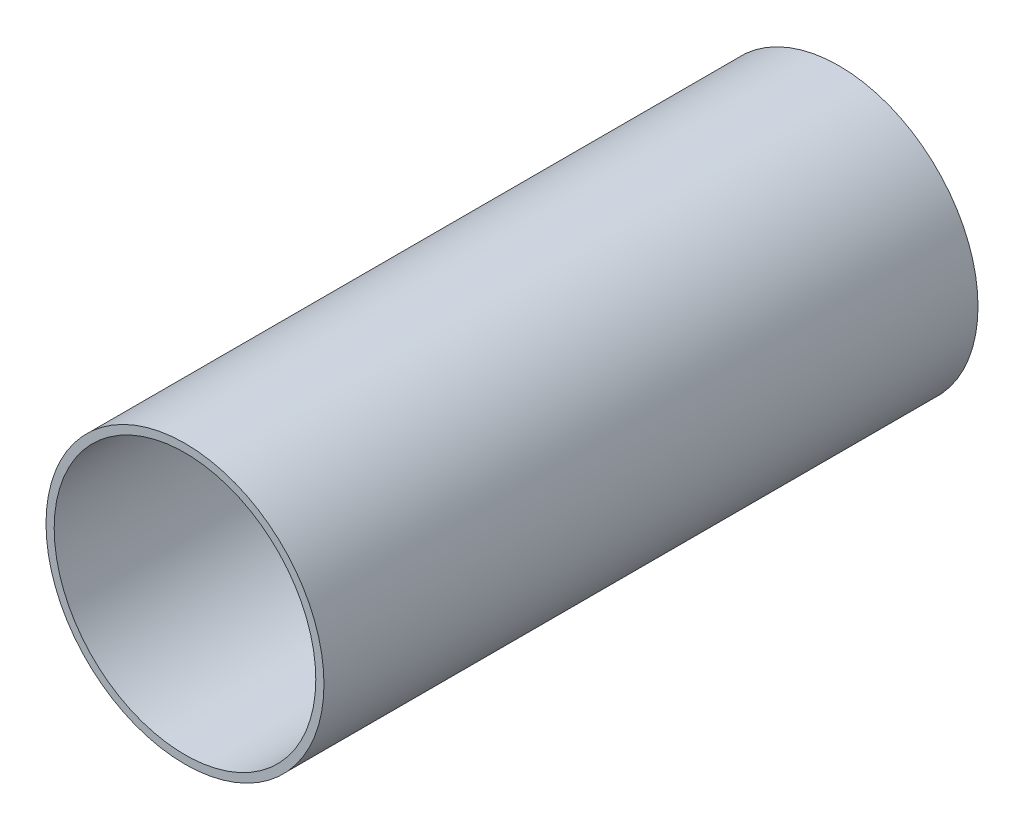
ISO-10303-21;
HEADER;
FILE_DESCRIPTION(('STEP AP214'),'2;1');
FILE_NAME('part.step','',(''),(''),'','','');
FILE_SCHEMA(('AUTOMOTIVE_DESIGN { 1 0 10303 214 1 1 1 1 }'));
ENDSEC;
DATA;
#1=APPLICATION_CONTEXT('core data for automotive mechanical design processes');
#2=APPLICATION_PROTOCOL_DEFINITION('international standard','automotive_design',2000,#1);
#3=PRODUCT_CONTEXT('',#1,'mechanical');
#4=PRODUCT('Part','Part','',(#3));
#5=PRODUCT_RELATED_PRODUCT_CATEGORY('part','',(#4));
#6=PRODUCT_DEFINITION_FORMATION('','',#4);
#7=PRODUCT_DEFINITION_CONTEXT('part definition',#1,'design');
#8=PRODUCT_DEFINITION('design','',#6,#7);
#9=PRODUCT_DEFINITION_SHAPE('','',#8);
#10=(LENGTH_UNIT() NAMED_UNIT(*) SI_UNIT(.MILLI.,.METRE.));
#11=(NAMED_UNIT(*) PLANE_ANGLE_UNIT() SI_UNIT($,.RADIAN.));
#12=(NAMED_UNIT(*) SI_UNIT($,.STERADIAN.) SOLID_ANGLE_UNIT());
#13=UNCERTAINTY_MEASURE_WITH_UNIT(LENGTH_MEASURE(1.E-05),#10,'distance_accuracy_value','');
#14=(GEOMETRIC_REPRESENTATION_CONTEXT(3) GLOBAL_UNCERTAINTY_ASSIGNED_CONTEXT((#13)) GLOBAL_UNIT_ASSIGNED_CONTEXT((#10,
#11,#12)) REPRESENTATION_CONTEXT('',''));
#15=CARTESIAN_POINT('',(0.,0.,0.));
#16=DIRECTION('',(0.,0.,1.));
#17=DIRECTION('',(1.,0.,0.));
#18=AXIS2_PLACEMENT_3D('',#15,#16,#17);
#19=CARTESIAN_POINT('',(0.,4.25,0.));
#20=DIRECTION('',(0.,0.,-1.));
#21=DIRECTION('',(-1.,0.,0.));
#22=AXIS2_PLACEMENT_3D('',#19,#20,#21);
#23=PLANE('',#22);
#24=CARTESIAN_POINT('',(0.,0.,0.));
#25=DIRECTION('',(0.,0.,1.));
#26=DIRECTION('',(1.,0.,0.));
#27=AXIS2_PLACEMENT_3D('',#24,#25,#26);
#28=CIRCLE('',#27,4.);
#29=CARTESIAN_POINT('',(4.,0.,0.));
#30=VERTEX_POINT('',#29);
#31=EDGE_CURVE('E10',#30,#30,#28,.T.);
#32=ORIENTED_EDGE('',*,*,#31,.F.);
#33=EDGE_LOOP('',(#32));
#34=FACE_BOUND('',#33,.T.);
#35=CARTESIAN_POINT('',(0.,0.,0.));
#36=DIRECTION('',(0.,0.,1.));
#37=DIRECTION('',(1.,0.,0.));
#38=AXIS2_PLACEMENT_3D('',#35,#36,#37);
#39=CIRCLE('',#38,4.25);
#40=CARTESIAN_POINT('',(4.25,0.,0.));
#41=VERTEX_POINT('',#40);
#42=EDGE_CURVE('E54',#41,#41,#39,.T.);
#43=ORIENTED_EDGE('',*,*,#42,.T.);
#44=EDGE_LOOP('',(#43));
#45=FACE_BOUND('',#44,.T.);
#46=ADVANCED_FACE('F36',(#34,#45),#23,.F.);
#47=CARTESIAN_POINT('',(0.,0.,0.));
#48=DIRECTION('',(0.,0.,1.));
#49=DIRECTION('',(1.,0.,0.));
#50=AXIS2_PLACEMENT_3D('',#47,#48,#49);
#51=CYLINDRICAL_SURFACE('',#50,4.);
#52=CARTESIAN_POINT('',(0.,0.,-20.));
#53=DIRECTION('',(0.,0.,1.));
#54=DIRECTION('',(1.,0.,0.));
#55=AXIS2_PLACEMENT_3D('',#52,#53,#54);
#56=CIRCLE('',#55,4.);
#57=CARTESIAN_POINT('',(4.,0.,-20.));
#58=VERTEX_POINT('',#57);
#59=EDGE_CURVE('E43',#58,#58,#56,.T.);
#60=ORIENTED_EDGE('',*,*,#59,.F.);
#61=EDGE_LOOP('',(#60));
#62=FACE_BOUND('',#61,.T.);
#63=ORIENTED_EDGE('',*,*,#31,.T.);
#64=EDGE_LOOP('',(#63));
#65=FACE_BOUND('',#64,.T.);
#66=ADVANCED_FACE('F69',(#62,#65),#51,.F.);
#67=CARTESIAN_POINT('',(0.,4.25,-20.));
#68=DIRECTION('',(0.,0.,1.));
#69=DIRECTION('',(1.,0.,0.));
#70=AXIS2_PLACEMENT_3D('',#67,#68,#69);
#71=PLANE('',#70);
#72=CARTESIAN_POINT('',(0.,0.,-20.));
#73=DIRECTION('',(0.,0.,1.));
#74=DIRECTION('',(1.,0.,0.));
#75=AXIS2_PLACEMENT_3D('',#72,#73,#74);
#76=CIRCLE('',#75,4.25);
#77=CARTESIAN_POINT('',(4.25,0.,-20.));
#78=VERTEX_POINT('',#77);
#79=EDGE_CURVE('E49',#78,#78,#76,.T.);
#80=ORIENTED_EDGE('',*,*,#79,.F.);
#81=EDGE_LOOP('',(#80));
#82=FACE_BOUND('',#81,.T.);
#83=ORIENTED_EDGE('',*,*,#59,.T.);
#84=EDGE_LOOP('',(#83));
#85=FACE_BOUND('',#84,.T.);
#86=ADVANCED_FACE('F64',(#82,#85),#71,.F.);
#87=CARTESIAN_POINT('',(0.,0.,0.));
#88=DIRECTION('',(0.,0.,1.));
#89=DIRECTION('',(1.,0.,0.));
#90=AXIS2_PLACEMENT_3D('',#87,#88,#89);
#91=CYLINDRICAL_SURFACE('',#90,4.25);
#92=ORIENTED_EDGE('',*,*,#42,.F.);
#93=EDGE_LOOP('',(#92));
#94=FACE_BOUND('',#93,.T.);
#95=ORIENTED_EDGE('',*,*,#79,.T.);
#96=EDGE_LOOP('',(#95));
#97=FACE_BOUND('',#96,.T.);
#98=ADVANCED_FACE('F61',(#94,#97),#91,.T.);
#99=CLOSED_SHELL('',(#46,#66,#86,#98));
#100=MANIFOLD_SOLID_BREP('B2',#99);
#101=ADVANCED_BREP_SHAPE_REPRESENTATION('',(#18,#100),#14);
#102=SHAPE_DEFINITION_REPRESENTATION(#9,#101);
ENDSEC;
END-ISO-10303-21;
